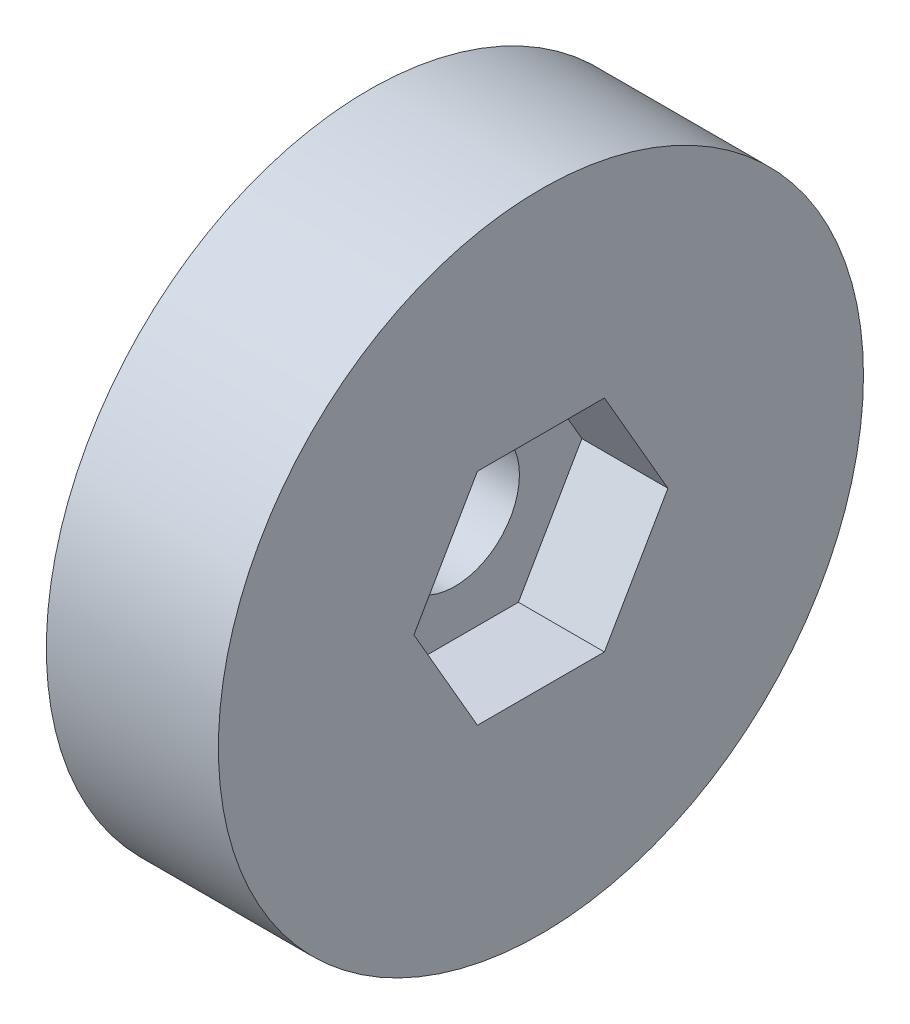
ISO-10303-21;
HEADER;
FILE_DESCRIPTION(('STEP AP214'),'2;1');
FILE_NAME('part.step','',(''),(''),'','','');
FILE_SCHEMA(('AUTOMOTIVE_DESIGN { 1 0 10303 214 1 1 1 1 }'));
ENDSEC;
DATA;
#1=APPLICATION_CONTEXT('core data for automotive mechanical design processes');
#2=APPLICATION_PROTOCOL_DEFINITION('international standard','automotive_design',2000,#1);
#3=PRODUCT_CONTEXT('',#1,'mechanical');
#4=PRODUCT('Part','Part','',(#3));
#5=PRODUCT_RELATED_PRODUCT_CATEGORY('part','',(#4));
#6=PRODUCT_DEFINITION_FORMATION('','',#4);
#7=PRODUCT_DEFINITION_CONTEXT('part definition',#1,'design');
#8=PRODUCT_DEFINITION('design','',#6,#7);
#9=PRODUCT_DEFINITION_SHAPE('','',#8);
#10=(LENGTH_UNIT() NAMED_UNIT(*) SI_UNIT(.MILLI.,.METRE.));
#11=(NAMED_UNIT(*) PLANE_ANGLE_UNIT() SI_UNIT($,.RADIAN.));
#12=(NAMED_UNIT(*) SI_UNIT($,.STERADIAN.) SOLID_ANGLE_UNIT());
#13=UNCERTAINTY_MEASURE_WITH_UNIT(LENGTH_MEASURE(1.E-05),#10,'distance_accuracy_value','');
#14=(GEOMETRIC_REPRESENTATION_CONTEXT(3) GLOBAL_UNCERTAINTY_ASSIGNED_CONTEXT((#13)) GLOBAL_UNIT_ASSIGNED_CONTEXT((#10,
#11,#12)) REPRESENTATION_CONTEXT('',''));
#15=CARTESIAN_POINT('',(0.,0.,0.));
#16=DIRECTION('',(0.,0.,1.));
#17=DIRECTION('',(1.,0.,0.));
#18=AXIS2_PLACEMENT_3D('',#15,#16,#17);
#19=CARTESIAN_POINT('',(5.08,0.,0.));
#20=DIRECTION('',(1.,0.,0.));
#21=DIRECTION('',(0.,0.,-1.));
#22=AXIS2_PLACEMENT_3D('',#19,#20,#21);
#23=PLANE('',#22);
#24=DIRECTION('',(0.,0.866025403784439,-0.499999999999999));
#25=VECTOR('',#24,1.);
#26=CARTESIAN_POINT('',(5.08,-6.49519052838329,-3.75));
#27=LINE('',#26,#25);
#28=CARTESIAN_POINT('',(5.08,-6.49519052838329,-3.75));
#29=VERTEX_POINT('',#28);
#30=CARTESIAN_POINT('',(5.08,0.,-7.5));
#31=VERTEX_POINT('',#30);
#32=EDGE_CURVE('E47',#29,#31,#27,.T.);
#33=ORIENTED_EDGE('',*,*,#32,.T.);
#34=DIRECTION('',(0.,0.866025403784439,0.5));
#35=VECTOR('',#34,1.);
#36=CARTESIAN_POINT('',(5.08,0.,-7.5));
#37=LINE('',#36,#35);
#38=CARTESIAN_POINT('',(5.08,6.49519052838329,-3.75));
#39=VERTEX_POINT('',#38);
#40=EDGE_CURVE('E51',#31,#39,#37,.T.);
#41=ORIENTED_EDGE('',*,*,#40,.T.);
#42=DIRECTION('',(0.,0.,1.));
#43=VECTOR('',#42,1.);
#44=CARTESIAN_POINT('',(5.08,6.49519052838329,-3.75));
#45=LINE('',#44,#43);
#46=CARTESIAN_POINT('',(5.08,6.49519052838329,3.75));
#47=VERTEX_POINT('',#46);
#48=EDGE_CURVE('E118',#39,#47,#45,.T.);
#49=ORIENTED_EDGE('',*,*,#48,.T.);
#50=DIRECTION('',(0.,-0.866025403784439,0.5));
#51=VECTOR('',#50,1.);
#52=CARTESIAN_POINT('',(5.08,6.49519052838329,3.75));
#53=LINE('',#52,#51);
#54=CARTESIAN_POINT('',(5.08,0.,7.5));
#55=VERTEX_POINT('',#54);
#56=EDGE_CURVE('E120',#47,#55,#53,.T.);
#57=ORIENTED_EDGE('',*,*,#56,.T.);
#58=DIRECTION('',(0.,-0.866025403784438,-0.5));
#59=VECTOR('',#58,1.);
#60=CARTESIAN_POINT('',(5.08,0.,7.5));
#61=LINE('',#60,#59);
#62=CARTESIAN_POINT('',(5.08,-6.49519052838329,3.75));
#63=VERTEX_POINT('',#62);
#64=EDGE_CURVE('E122',#55,#63,#61,.T.);
#65=ORIENTED_EDGE('',*,*,#64,.T.);
#66=DIRECTION('',(0.,0.,-1.));
#67=VECTOR('',#66,1.);
#68=CARTESIAN_POINT('',(5.08,-6.49519052838329,3.75));
#69=LINE('',#68,#67);
#70=EDGE_CURVE('E94',#63,#29,#69,.T.);
#71=ORIENTED_EDGE('',*,*,#70,.T.);
#72=EDGE_LOOP('',(#33,#41,#49,#57,#65,#71));
#73=FACE_BOUND('',#72,.T.);
#74=CARTESIAN_POINT('',(5.08,0.,0.));
#75=DIRECTION('',(1.,0.,0.));
#76=DIRECTION('',(0.,0.,-1.));
#77=AXIS2_PLACEMENT_3D('',#74,#75,#76);
#78=CIRCLE('',#77,3.81);
#79=CARTESIAN_POINT('',(5.08,0.,-3.81));
#80=VERTEX_POINT('',#79);
#81=EDGE_CURVE('E40',#80,#80,#78,.T.);
#82=ORIENTED_EDGE('',*,*,#81,.F.);
#83=EDGE_LOOP('',(#82));
#84=FACE_BOUND('',#83,.T.);
#85=ADVANCED_FACE('F32',(#73,#84),#23,.T.);
#86=CARTESIAN_POINT('',(0.,0.,0.));
#87=DIRECTION('',(1.,0.,0.));
#88=DIRECTION('',(0.,0.,-1.));
#89=AXIS2_PLACEMENT_3D('',#86,#87,#88);
#90=PLANE('',#89);
#91=CARTESIAN_POINT('',(0.,0.,0.));
#92=DIRECTION('',(1.,0.,0.));
#93=DIRECTION('',(0.,0.,-1.));
#94=AXIS2_PLACEMENT_3D('',#91,#92,#93);
#95=CIRCLE('',#94,19.05);
#96=CARTESIAN_POINT('',(0.,0.,-19.05));
#97=VERTEX_POINT('',#96);
#98=EDGE_CURVE('E11',#97,#97,#95,.T.);
#99=ORIENTED_EDGE('',*,*,#98,.F.);
#100=EDGE_LOOP('',(#99));
#101=FACE_BOUND('',#100,.T.);
#102=CARTESIAN_POINT('',(0.,0.,0.));
#103=DIRECTION('',(1.,0.,0.));
#104=DIRECTION('',(0.,0.,-1.));
#105=AXIS2_PLACEMENT_3D('',#102,#103,#104);
#106=CIRCLE('',#105,3.81);
#107=CARTESIAN_POINT('',(0.,0.,-3.81));
#108=VERTEX_POINT('',#107);
#109=EDGE_CURVE('E138',#108,#108,#106,.T.);
#110=ORIENTED_EDGE('',*,*,#109,.T.);
#111=EDGE_LOOP('',(#110));
#112=FACE_BOUND('',#111,.T.);
#113=ADVANCED_FACE('F143',(#101,#112),#90,.F.);
#114=CARTESIAN_POINT('',(5.08,0.,0.));
#115=DIRECTION('',(-1.,0.,0.));
#116=DIRECTION('',(0.,0.,1.));
#117=AXIS2_PLACEMENT_3D('',#114,#115,#116);
#118=CYLINDRICAL_SURFACE('',#117,19.05);
#119=ORIENTED_EDGE('',*,*,#98,.T.);
#120=EDGE_LOOP('',(#119));
#121=FACE_BOUND('',#120,.T.);
#122=CARTESIAN_POINT('',(10.16,0.,0.));
#123=DIRECTION('',(1.,0.,0.));
#124=DIRECTION('',(0.,0.,-1.));
#125=AXIS2_PLACEMENT_3D('',#122,#123,#124);
#126=CIRCLE('',#125,19.05);
#127=CARTESIAN_POINT('',(10.16,0.,-19.05));
#128=VERTEX_POINT('',#127);
#129=EDGE_CURVE('E99',#128,#128,#126,.T.);
#130=ORIENTED_EDGE('',*,*,#129,.F.);
#131=EDGE_LOOP('',(#130));
#132=FACE_BOUND('',#131,.T.);
#133=ADVANCED_FACE('F34',(#121,#132),#118,.T.);
#134=CARTESIAN_POINT('',(5.08,0.,0.));
#135=DIRECTION('',(-1.,0.,0.));
#136=DIRECTION('',(0.,0.,1.));
#137=AXIS2_PLACEMENT_3D('',#134,#135,#136);
#138=CYLINDRICAL_SURFACE('',#137,3.81);
#139=ORIENTED_EDGE('',*,*,#81,.T.);
#140=EDGE_LOOP('',(#139));
#141=FACE_BOUND('',#140,.T.);
#142=ORIENTED_EDGE('',*,*,#109,.F.);
#143=EDGE_LOOP('',(#142));
#144=FACE_BOUND('',#143,.T.);
#145=ADVANCED_FACE('F145',(#141,#144),#138,.F.);
#146=CARTESIAN_POINT('',(10.16,0.,0.));
#147=DIRECTION('',(1.,0.,0.));
#148=DIRECTION('',(0.,0.,-1.));
#149=AXIS2_PLACEMENT_3D('',#146,#147,#148);
#150=PLANE('',#149);
#151=ORIENTED_EDGE('',*,*,#129,.T.);
#152=EDGE_LOOP('',(#151));
#153=FACE_BOUND('',#152,.T.);
#154=DIRECTION('',(0.,0.866025403784439,0.5));
#155=VECTOR('',#154,1.);
#156=CARTESIAN_POINT('',(10.16,0.,-7.5));
#157=LINE('',#156,#155);
#158=CARTESIAN_POINT('',(10.16,0.,-7.5));
#159=VERTEX_POINT('',#158);
#160=CARTESIAN_POINT('',(10.16,6.49519052838329,-3.75));
#161=VERTEX_POINT('',#160);
#162=EDGE_CURVE('E93',#159,#161,#157,.T.);
#163=ORIENTED_EDGE('',*,*,#162,.F.);
#164=DIRECTION('',(0.,0.866025403784439,-0.499999999999999));
#165=VECTOR('',#164,1.);
#166=CARTESIAN_POINT('',(10.16,-6.49519052838329,-3.75));
#167=LINE('',#166,#165);
#168=CARTESIAN_POINT('',(10.16,-6.49519052838329,-3.75));
#169=VERTEX_POINT('',#168);
#170=EDGE_CURVE('E84',#169,#159,#167,.T.);
#171=ORIENTED_EDGE('',*,*,#170,.F.);
#172=DIRECTION('',(0.,0.,-1.));
#173=VECTOR('',#172,1.);
#174=CARTESIAN_POINT('',(10.16,-6.49519052838329,3.75));
#175=LINE('',#174,#173);
#176=CARTESIAN_POINT('',(10.16,-6.49519052838329,3.75));
#177=VERTEX_POINT('',#176);
#178=EDGE_CURVE('E114',#177,#169,#175,.T.);
#179=ORIENTED_EDGE('',*,*,#178,.F.);
#180=DIRECTION('',(0.,-0.866025403784438,-0.5));
#181=VECTOR('',#180,1.);
#182=CARTESIAN_POINT('',(10.16,0.,7.5));
#183=LINE('',#182,#181);
#184=CARTESIAN_POINT('',(10.16,0.,7.5));
#185=VERTEX_POINT('',#184);
#186=EDGE_CURVE('E111',#185,#177,#183,.T.);
#187=ORIENTED_EDGE('',*,*,#186,.F.);
#188=DIRECTION('',(0.,-0.866025403784439,0.5));
#189=VECTOR('',#188,1.);
#190=CARTESIAN_POINT('',(10.16,6.49519052838329,3.75));
#191=LINE('',#190,#189);
#192=CARTESIAN_POINT('',(10.16,6.49519052838329,3.75));
#193=VERTEX_POINT('',#192);
#194=EDGE_CURVE('E107',#193,#185,#191,.T.);
#195=ORIENTED_EDGE('',*,*,#194,.F.);
#196=DIRECTION('',(0.,0.,1.));
#197=VECTOR('',#196,1.);
#198=CARTESIAN_POINT('',(10.16,6.49519052838329,-3.75));
#199=LINE('',#198,#197);
#200=EDGE_CURVE('E105',#161,#193,#199,.T.);
#201=ORIENTED_EDGE('',*,*,#200,.F.);
#202=EDGE_LOOP('',(#163,#171,#179,#187,#195,#201));
#203=FACE_BOUND('',#202,.T.);
#204=ADVANCED_FACE('F103',(#153,#203),#150,.T.);
#205=CARTESIAN_POINT('',(10.16,-6.49519052838329,-3.75));
#206=DIRECTION('',(0.,0.499999999999999,0.866025403784439));
#207=DIRECTION('',(0.,-0.866025403784439,0.5));
#208=AXIS2_PLACEMENT_3D('',#205,#206,#207);
#209=PLANE('',#208);
#210=ORIENTED_EDGE('',*,*,#32,.F.);
#211=DIRECTION('',(-1.,0.,0.));
#212=VECTOR('',#211,1.);
#213=CARTESIAN_POINT('',(10.16,-6.49519052838329,-3.75));
#214=LINE('',#213,#212);
#215=EDGE_CURVE('E89',#169,#29,#214,.T.);
#216=ORIENTED_EDGE('',*,*,#215,.F.);
#217=ORIENTED_EDGE('',*,*,#170,.T.);
#218=DIRECTION('',(-1.,0.,0.));
#219=VECTOR('',#218,1.);
#220=CARTESIAN_POINT('',(10.16,0.,-7.5));
#221=LINE('',#220,#219);
#222=EDGE_CURVE('E87',#159,#31,#221,.T.);
#223=ORIENTED_EDGE('',*,*,#222,.T.);
#224=EDGE_LOOP('',(#210,#216,#217,#223));
#225=FACE_BOUND('',#224,.T.);
#226=ADVANCED_FACE('F86',(#225),#209,.T.);
#227=CARTESIAN_POINT('',(10.16,0.,-7.5));
#228=DIRECTION('',(0.,-0.5,0.866025403784439));
#229=DIRECTION('',(0.,-0.866025403784439,-0.5));
#230=AXIS2_PLACEMENT_3D('',#227,#228,#229);
#231=PLANE('',#230);
#232=ORIENTED_EDGE('',*,*,#40,.F.);
#233=ORIENTED_EDGE('',*,*,#222,.F.);
#234=ORIENTED_EDGE('',*,*,#162,.T.);
#235=DIRECTION('',(-1.,0.,0.));
#236=VECTOR('',#235,1.);
#237=CARTESIAN_POINT('',(10.16,6.49519052838329,-3.75));
#238=LINE('',#237,#236);
#239=EDGE_CURVE('E100',#161,#39,#238,.T.);
#240=ORIENTED_EDGE('',*,*,#239,.T.);
#241=EDGE_LOOP('',(#232,#233,#234,#240));
#242=FACE_BOUND('',#241,.T.);
#243=ADVANCED_FACE('F97',(#242),#231,.T.);
#244=CARTESIAN_POINT('',(10.16,6.49519052838329,-3.75));
#245=DIRECTION('',(0.,-1.,0.));
#246=DIRECTION('',(0.,0.,-1.));
#247=AXIS2_PLACEMENT_3D('',#244,#245,#246);
#248=PLANE('',#247);
#249=ORIENTED_EDGE('',*,*,#48,.F.);
#250=ORIENTED_EDGE('',*,*,#239,.F.);
#251=ORIENTED_EDGE('',*,*,#200,.T.);
#252=DIRECTION('',(-1.,0.,0.));
#253=VECTOR('',#252,1.);
#254=CARTESIAN_POINT('',(10.16,6.49519052838329,3.75));
#255=LINE('',#254,#253);
#256=EDGE_CURVE('E132',#193,#47,#255,.T.);
#257=ORIENTED_EDGE('',*,*,#256,.T.);
#258=EDGE_LOOP('',(#249,#250,#251,#257));
#259=FACE_BOUND('',#258,.T.);
#260=ADVANCED_FACE('F200',(#259),#248,.T.);
#261=CARTESIAN_POINT('',(10.16,6.49519052838329,3.75));
#262=DIRECTION('',(0.,-0.5,-0.866025403784439));
#263=DIRECTION('',(0.,0.866025403784439,-0.5));
#264=AXIS2_PLACEMENT_3D('',#261,#262,#263);
#265=PLANE('',#264);
#266=ORIENTED_EDGE('',*,*,#56,.F.);
#267=ORIENTED_EDGE('',*,*,#256,.F.);
#268=ORIENTED_EDGE('',*,*,#194,.T.);
#269=DIRECTION('',(-1.,0.,0.));
#270=VECTOR('',#269,1.);
#271=CARTESIAN_POINT('',(10.16,0.,7.5));
#272=LINE('',#271,#270);
#273=EDGE_CURVE('E129',#185,#55,#272,.T.);
#274=ORIENTED_EDGE('',*,*,#273,.T.);
#275=EDGE_LOOP('',(#266,#267,#268,#274));
#276=FACE_BOUND('',#275,.T.);
#277=ADVANCED_FACE('F209',(#276),#265,.T.);
#278=CARTESIAN_POINT('',(10.16,0.,7.5));
#279=DIRECTION('',(0.,0.5,-0.866025403784439));
#280=DIRECTION('',(0.,0.866025403784438,0.5));
#281=AXIS2_PLACEMENT_3D('',#278,#279,#280);
#282=PLANE('',#281);
#283=ORIENTED_EDGE('',*,*,#64,.F.);
#284=ORIENTED_EDGE('',*,*,#273,.F.);
#285=ORIENTED_EDGE('',*,*,#186,.T.);
#286=DIRECTION('',(-1.,0.,0.));
#287=VECTOR('',#286,1.);
#288=CARTESIAN_POINT('',(10.16,-6.49519052838329,3.75));
#289=LINE('',#288,#287);
#290=EDGE_CURVE('E126',#177,#63,#289,.T.);
#291=ORIENTED_EDGE('',*,*,#290,.T.);
#292=EDGE_LOOP('',(#283,#284,#285,#291));
#293=FACE_BOUND('',#292,.T.);
#294=ADVANCED_FACE('F219',(#293),#282,.T.);
#295=CARTESIAN_POINT('',(10.16,-6.49519052838329,3.75));
#296=DIRECTION('',(0.,1.,0.));
#297=DIRECTION('',(0.,0.,1.));
#298=AXIS2_PLACEMENT_3D('',#295,#296,#297);
#299=PLANE('',#298);
#300=ORIENTED_EDGE('',*,*,#70,.F.);
#301=ORIENTED_EDGE('',*,*,#290,.F.);
#302=ORIENTED_EDGE('',*,*,#178,.T.);
#303=ORIENTED_EDGE('',*,*,#215,.T.);
#304=EDGE_LOOP('',(#300,#301,#302,#303));
#305=FACE_BOUND('',#304,.T.);
#306=ADVANCED_FACE('F229',(#305),#299,.T.);
#307=CLOSED_SHELL('',(#85,#113,#133,#145,#204,#226,#243,#260,#277,#294,#306));
#308=MANIFOLD_SOLID_BREP('B2',#307);
#309=ADVANCED_BREP_SHAPE_REPRESENTATION('',(#18,#308),#14);
#310=SHAPE_DEFINITION_REPRESENTATION(#9,#309);
ENDSEC;
END-ISO-10303-21;
